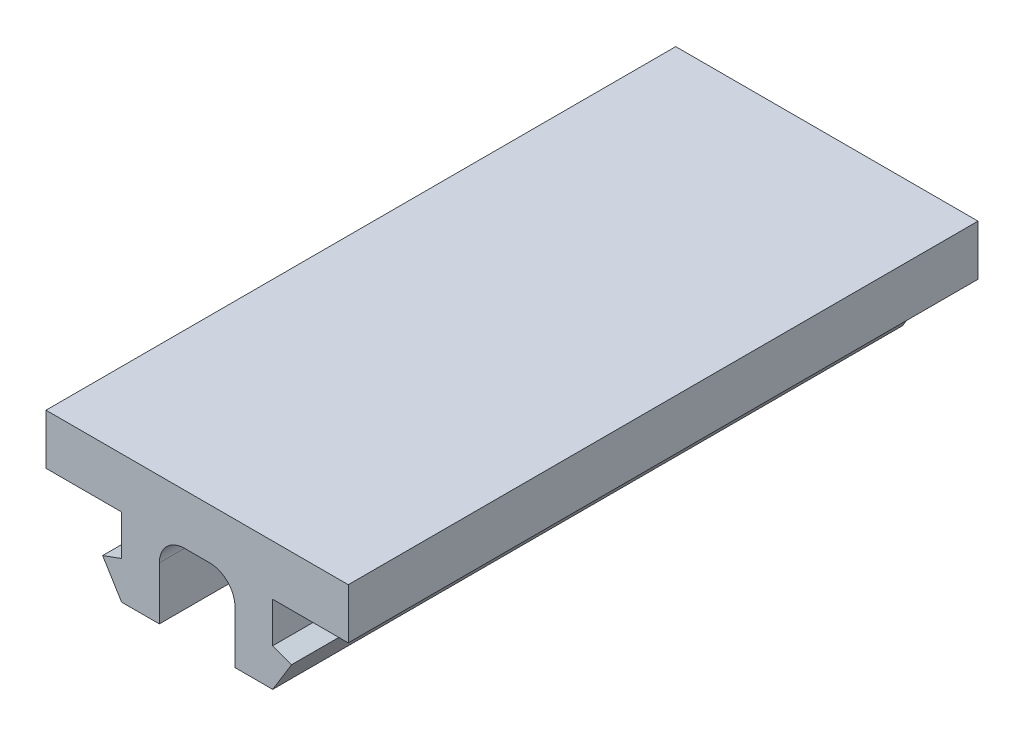
ISO-10303-21;
HEADER;
FILE_DESCRIPTION(('STEP AP214'),'2;1');
FILE_NAME('part.step','',(''),(''),'','','');
FILE_SCHEMA(('AUTOMOTIVE_DESIGN { 1 0 10303 214 1 1 1 1 }'));
ENDSEC;
DATA;
#1=APPLICATION_CONTEXT('core data for automotive mechanical design processes');
#2=APPLICATION_PROTOCOL_DEFINITION('international standard','automotive_design',2000,#1);
#3=PRODUCT_CONTEXT('',#1,'mechanical');
#4=PRODUCT('Part','Part','',(#3));
#5=PRODUCT_RELATED_PRODUCT_CATEGORY('part','',(#4));
#6=PRODUCT_DEFINITION_FORMATION('','',#4);
#7=PRODUCT_DEFINITION_CONTEXT('part definition',#1,'design');
#8=PRODUCT_DEFINITION('design','',#6,#7);
#9=PRODUCT_DEFINITION_SHAPE('','',#8);
#10=(LENGTH_UNIT() NAMED_UNIT(*) SI_UNIT(.MILLI.,.METRE.));
#11=(NAMED_UNIT(*) PLANE_ANGLE_UNIT() SI_UNIT($,.RADIAN.));
#12=(NAMED_UNIT(*) SI_UNIT($,.STERADIAN.) SOLID_ANGLE_UNIT());
#13=UNCERTAINTY_MEASURE_WITH_UNIT(LENGTH_MEASURE(1.E-05),#10,'distance_accuracy_value','');
#14=(GEOMETRIC_REPRESENTATION_CONTEXT(3) GLOBAL_UNCERTAINTY_ASSIGNED_CONTEXT((#13)) GLOBAL_UNIT_ASSIGNED_CONTEXT((#10,
#11,#12)) REPRESENTATION_CONTEXT('',''));
#15=CARTESIAN_POINT('',(0.,0.,0.));
#16=DIRECTION('',(0.,0.,1.));
#17=DIRECTION('',(1.,0.,0.));
#18=AXIS2_PLACEMENT_3D('',#15,#16,#17);
#19=CARTESIAN_POINT('',(12.,0.,25.));
#20=DIRECTION('',(-1.,0.,0.));
#21=DIRECTION('',(0.,0.,1.));
#22=AXIS2_PLACEMENT_3D('',#19,#20,#21);
#23=PLANE('',#22);
#24=DIRECTION('',(0.,1.,0.));
#25=VECTOR('',#24,1.);
#26=CARTESIAN_POINT('',(12.,0.,0.));
#27=LINE('',#26,#25);
#28=CARTESIAN_POINT('',(12.,-2.,0.));
#29=VERTEX_POINT('',#28);
#30=CARTESIAN_POINT('',(12.,0.,0.));
#31=VERTEX_POINT('',#30);
#32=EDGE_CURVE('E200',#29,#31,#27,.T.);
#33=ORIENTED_EDGE('',*,*,#32,.T.);
#34=DIRECTION('',(0.,0.,-1.));
#35=VECTOR('',#34,1.);
#36=CARTESIAN_POINT('',(12.,0.,25.));
#37=LINE('',#36,#35);
#38=CARTESIAN_POINT('',(12.,0.,25.));
#39=VERTEX_POINT('',#38);
#40=EDGE_CURVE('E11',#39,#31,#37,.T.);
#41=ORIENTED_EDGE('',*,*,#40,.F.);
#42=DIRECTION('',(0.,1.,0.));
#43=VECTOR('',#42,1.);
#44=CARTESIAN_POINT('',(12.,0.,25.));
#45=LINE('',#44,#43);
#46=CARTESIAN_POINT('',(12.,-2.,25.));
#47=VERTEX_POINT('',#46);
#48=EDGE_CURVE('E252',#47,#39,#45,.T.);
#49=ORIENTED_EDGE('',*,*,#48,.F.);
#50=DIRECTION('',(0.,0.,-1.));
#51=VECTOR('',#50,1.);
#52=CARTESIAN_POINT('',(12.,-2.,25.));
#53=LINE('',#52,#51);
#54=EDGE_CURVE('E196',#47,#29,#53,.T.);
#55=ORIENTED_EDGE('',*,*,#54,.T.);
#56=EDGE_LOOP('',(#33,#41,#49,#55));
#57=FACE_BOUND('',#56,.T.);
#58=ADVANCED_FACE('F39',(#57),#23,.F.);
#59=CARTESIAN_POINT('',(0.,0.,25.));
#60=DIRECTION('',(0.,-1.,0.));
#61=DIRECTION('',(0.,0.,-1.));
#62=AXIS2_PLACEMENT_3D('',#59,#60,#61);
#63=PLANE('',#62);
#64=DIRECTION('',(-1.,0.,0.));
#65=VECTOR('',#64,1.);
#66=CARTESIAN_POINT('',(0.,0.,0.));
#67=LINE('',#66,#65);
#68=CARTESIAN_POINT('',(0.,0.,0.));
#69=VERTEX_POINT('',#68);
#70=EDGE_CURVE('E204',#31,#69,#67,.T.);
#71=ORIENTED_EDGE('',*,*,#70,.T.);
#72=DIRECTION('',(0.,0.,-1.));
#73=VECTOR('',#72,1.);
#74=CARTESIAN_POINT('',(0.,0.,25.));
#75=LINE('',#74,#73);
#76=CARTESIAN_POINT('',(0.,0.,25.));
#77=VERTEX_POINT('',#76);
#78=EDGE_CURVE('E48',#77,#69,#75,.T.);
#79=ORIENTED_EDGE('',*,*,#78,.F.);
#80=DIRECTION('',(-1.,0.,0.));
#81=VECTOR('',#80,1.);
#82=CARTESIAN_POINT('',(0.,0.,25.));
#83=LINE('',#82,#81);
#84=EDGE_CURVE('E129',#39,#77,#83,.T.);
#85=ORIENTED_EDGE('',*,*,#84,.F.);
#86=ORIENTED_EDGE('',*,*,#40,.T.);
#87=EDGE_LOOP('',(#71,#79,#85,#86));
#88=FACE_BOUND('',#87,.T.);
#89=ADVANCED_FACE('F388',(#88),#63,.F.);
#90=CARTESIAN_POINT('',(0.,-2.,25.));
#91=DIRECTION('',(1.,0.,0.));
#92=DIRECTION('',(0.,0.,-1.));
#93=AXIS2_PLACEMENT_3D('',#90,#91,#92);
#94=PLANE('',#93);
#95=DIRECTION('',(0.,-1.,0.));
#96=VECTOR('',#95,1.);
#97=CARTESIAN_POINT('',(0.,-2.,0.));
#98=LINE('',#97,#96);
#99=CARTESIAN_POINT('',(0.,-2.,0.));
#100=VERTEX_POINT('',#99);
#101=EDGE_CURVE('E207',#69,#100,#98,.T.);
#102=ORIENTED_EDGE('',*,*,#101,.T.);
#103=DIRECTION('',(0.,0.,-1.));
#104=VECTOR('',#103,1.);
#105=CARTESIAN_POINT('',(0.,-2.,25.));
#106=LINE('',#105,#104);
#107=CARTESIAN_POINT('',(0.,-2.,25.));
#108=VERTEX_POINT('',#107);
#109=EDGE_CURVE('E303',#108,#100,#106,.T.);
#110=ORIENTED_EDGE('',*,*,#109,.F.);
#111=DIRECTION('',(0.,-1.,0.));
#112=VECTOR('',#111,1.);
#113=CARTESIAN_POINT('',(0.,-2.,25.));
#114=LINE('',#113,#112);
#115=EDGE_CURVE('E313',#77,#108,#114,.T.);
#116=ORIENTED_EDGE('',*,*,#115,.F.);
#117=ORIENTED_EDGE('',*,*,#78,.T.);
#118=EDGE_LOOP('',(#102,#110,#116,#117));
#119=FACE_BOUND('',#118,.T.);
#120=ADVANCED_FACE('F311',(#119),#94,.F.);
#121=CARTESIAN_POINT('',(3.,-2.,25.));
#122=DIRECTION('',(0.,1.,0.));
#123=DIRECTION('',(-1.,0.,0.));
#124=AXIS2_PLACEMENT_3D('',#121,#122,#123);
#125=PLANE('',#124);
#126=DIRECTION('',(1.,0.,0.));
#127=VECTOR('',#126,1.);
#128=CARTESIAN_POINT('',(3.,-2.,0.));
#129=LINE('',#128,#127);
#130=CARTESIAN_POINT('',(3.,-2.,0.));
#131=VERTEX_POINT('',#130);
#132=EDGE_CURVE('E210',#100,#131,#129,.T.);
#133=ORIENTED_EDGE('',*,*,#132,.T.);
#134=DIRECTION('',(0.,0.,-1.));
#135=VECTOR('',#134,1.);
#136=CARTESIAN_POINT('',(3.,-2.,25.));
#137=LINE('',#136,#135);
#138=CARTESIAN_POINT('',(3.,-2.,25.));
#139=VERTEX_POINT('',#138);
#140=EDGE_CURVE('E299',#139,#131,#137,.T.);
#141=ORIENTED_EDGE('',*,*,#140,.F.);
#142=DIRECTION('',(1.,0.,0.));
#143=VECTOR('',#142,1.);
#144=CARTESIAN_POINT('',(3.,-2.,25.));
#145=LINE('',#144,#143);
#146=EDGE_CURVE('E332',#108,#139,#145,.T.);
#147=ORIENTED_EDGE('',*,*,#146,.F.);
#148=ORIENTED_EDGE('',*,*,#109,.T.);
#149=EDGE_LOOP('',(#133,#141,#147,#148));
#150=FACE_BOUND('',#149,.T.);
#151=ADVANCED_FACE('F322',(#150),#125,.F.);
#152=CARTESIAN_POINT('',(3.,-3.6,25.));
#153=DIRECTION('',(1.,0.,0.));
#154=DIRECTION('',(0.,0.,-1.));
#155=AXIS2_PLACEMENT_3D('',#152,#153,#154);
#156=PLANE('',#155);
#157=DIRECTION('',(0.,-1.,0.));
#158=VECTOR('',#157,1.);
#159=CARTESIAN_POINT('',(3.,-3.6,0.));
#160=LINE('',#159,#158);
#161=CARTESIAN_POINT('',(3.,-3.6,0.));
#162=VERTEX_POINT('',#161);
#163=EDGE_CURVE('E213',#131,#162,#160,.T.);
#164=ORIENTED_EDGE('',*,*,#163,.T.);
#165=DIRECTION('',(0.,0.,-1.));
#166=VECTOR('',#165,1.);
#167=CARTESIAN_POINT('',(3.,-3.6,25.));
#168=LINE('',#167,#166);
#169=CARTESIAN_POINT('',(3.,-3.6,25.));
#170=VERTEX_POINT('',#169);
#171=EDGE_CURVE('E295',#170,#162,#168,.T.);
#172=ORIENTED_EDGE('',*,*,#171,.F.);
#173=DIRECTION('',(0.,-1.,0.));
#174=VECTOR('',#173,1.);
#175=CARTESIAN_POINT('',(3.,-3.6,25.));
#176=LINE('',#175,#174);
#177=EDGE_CURVE('E328',#139,#170,#176,.T.);
#178=ORIENTED_EDGE('',*,*,#177,.F.);
#179=ORIENTED_EDGE('',*,*,#140,.T.);
#180=EDGE_LOOP('',(#164,#172,#178,#179));
#181=FACE_BOUND('',#180,.T.);
#182=ADVANCED_FACE('F326',(#181),#156,.F.);
#183=CARTESIAN_POINT('',(2.24824590337127,-3.87361611466054,25.));
#184=DIRECTION('',(0.342020143325667,-0.939692620785909,0.));
#185=DIRECTION('',(0.939692620785909,0.342020143325667,0.));
#186=AXIS2_PLACEMENT_3D('',#183,#184,#185);
#187=PLANE('',#186);
#188=DIRECTION('',(-0.939692620785909,-0.342020143325667,0.));
#189=VECTOR('',#188,1.);
#190=CARTESIAN_POINT('',(2.24824590337127,-3.87361611466054,0.));
#191=LINE('',#190,#189);
#192=CARTESIAN_POINT('',(2.24824590337127,-3.87361611466054,0.));
#193=VERTEX_POINT('',#192);
#194=EDGE_CURVE('E216',#162,#193,#191,.T.);
#195=ORIENTED_EDGE('',*,*,#194,.T.);
#196=DIRECTION('',(0.,0.,-1.));
#197=VECTOR('',#196,1.);
#198=CARTESIAN_POINT('',(2.24824590337127,-3.87361611466054,25.));
#199=LINE('',#198,#197);
#200=CARTESIAN_POINT('',(2.24824590337127,-3.87361611466054,25.));
#201=VERTEX_POINT('',#200);
#202=EDGE_CURVE('E291',#201,#193,#199,.T.);
#203=ORIENTED_EDGE('',*,*,#202,.F.);
#204=DIRECTION('',(-0.939692620785909,-0.342020143325667,0.));
#205=VECTOR('',#204,1.);
#206=CARTESIAN_POINT('',(2.24824590337127,-3.87361611466054,25.));
#207=LINE('',#206,#205);
#208=EDGE_CURVE('E331',#170,#201,#207,.T.);
#209=ORIENTED_EDGE('',*,*,#208,.F.);
#210=ORIENTED_EDGE('',*,*,#171,.T.);
#211=EDGE_LOOP('',(#195,#203,#209,#210));
#212=FACE_BOUND('',#211,.T.);
#213=ADVANCED_FACE('F401',(#212),#187,.F.);
#214=CARTESIAN_POINT('',(3.,-5.1,25.));
#215=DIRECTION('',(0.852570445730035,0.522612318136197,0.));
#216=DIRECTION('',(-0.522612318136197,0.852570445730035,0.));
#217=AXIS2_PLACEMENT_3D('',#214,#215,#216);
#218=PLANE('',#217);
#219=DIRECTION('',(0.522612318136197,-0.852570445730035,0.));
#220=VECTOR('',#219,1.);
#221=CARTESIAN_POINT('',(3.,-5.1,0.));
#222=LINE('',#221,#220);
#223=CARTESIAN_POINT('',(3.,-5.1,0.));
#224=VERTEX_POINT('',#223);
#225=EDGE_CURVE('E219',#193,#224,#222,.T.);
#226=ORIENTED_EDGE('',*,*,#225,.T.);
#227=DIRECTION('',(0.,0.,-1.));
#228=VECTOR('',#227,1.);
#229=CARTESIAN_POINT('',(3.,-5.1,25.));
#230=LINE('',#229,#228);
#231=CARTESIAN_POINT('',(3.,-5.1,25.));
#232=VERTEX_POINT('',#231);
#233=EDGE_CURVE('E287',#232,#224,#230,.T.);
#234=ORIENTED_EDGE('',*,*,#233,.F.);
#235=DIRECTION('',(0.522612318136197,-0.852570445730035,0.));
#236=VECTOR('',#235,1.);
#237=CARTESIAN_POINT('',(3.,-5.1,25.));
#238=LINE('',#237,#236);
#239=EDGE_CURVE('E336',#201,#232,#238,.T.);
#240=ORIENTED_EDGE('',*,*,#239,.F.);
#241=ORIENTED_EDGE('',*,*,#202,.T.);
#242=EDGE_LOOP('',(#226,#234,#240,#241));
#243=FACE_BOUND('',#242,.T.);
#244=ADVANCED_FACE('F404',(#243),#218,.F.);
#245=CARTESIAN_POINT('',(4.5,-5.1,25.));
#246=DIRECTION('',(0.,1.,0.));
#247=DIRECTION('',(0.,0.,1.));
#248=AXIS2_PLACEMENT_3D('',#245,#246,#247);
#249=PLANE('',#248);
#250=DIRECTION('',(1.,0.,0.));
#251=VECTOR('',#250,1.);
#252=CARTESIAN_POINT('',(4.5,-5.1,0.));
#253=LINE('',#252,#251);
#254=CARTESIAN_POINT('',(4.5,-5.1,0.));
#255=VERTEX_POINT('',#254);
#256=EDGE_CURVE('E222',#224,#255,#253,.T.);
#257=ORIENTED_EDGE('',*,*,#256,.T.);
#258=DIRECTION('',(0.,0.,-1.));
#259=VECTOR('',#258,1.);
#260=CARTESIAN_POINT('',(4.5,-5.1,25.));
#261=LINE('',#260,#259);
#262=CARTESIAN_POINT('',(4.5,-5.1,25.));
#263=VERTEX_POINT('',#262);
#264=EDGE_CURVE('E283',#263,#255,#261,.T.);
#265=ORIENTED_EDGE('',*,*,#264,.F.);
#266=DIRECTION('',(1.,0.,0.));
#267=VECTOR('',#266,1.);
#268=CARTESIAN_POINT('',(4.5,-5.1,25.));
#269=LINE('',#268,#267);
#270=EDGE_CURVE('E343',#232,#263,#269,.T.);
#271=ORIENTED_EDGE('',*,*,#270,.F.);
#272=ORIENTED_EDGE('',*,*,#233,.T.);
#273=EDGE_LOOP('',(#257,#265,#271,#272));
#274=FACE_BOUND('',#273,.T.);
#275=ADVANCED_FACE('F408',(#274),#249,.F.);
#276=CARTESIAN_POINT('',(4.5,-5.1,25.));
#277=DIRECTION('',(-1.,0.,0.));
#278=DIRECTION('',(0.,0.,1.));
#279=AXIS2_PLACEMENT_3D('',#276,#277,#278);
#280=PLANE('',#279);
#281=DIRECTION('',(0.,1.,0.));
#282=VECTOR('',#281,1.);
#283=CARTESIAN_POINT('',(4.5,-5.1,0.));
#284=LINE('',#283,#282);
#285=CARTESIAN_POINT('',(4.5,-3.,0.));
#286=VERTEX_POINT('',#285);
#287=EDGE_CURVE('E225',#255,#286,#284,.T.);
#288=ORIENTED_EDGE('',*,*,#287,.T.);
#289=DIRECTION('',(0.,0.,-1.));
#290=VECTOR('',#289,1.);
#291=CARTESIAN_POINT('',(4.5,-3.,25.));
#292=LINE('',#291,#290);
#293=CARTESIAN_POINT('',(4.5,-3.,25.));
#294=VERTEX_POINT('',#293);
#295=EDGE_CURVE('E279',#294,#286,#292,.T.);
#296=ORIENTED_EDGE('',*,*,#295,.F.);
#297=DIRECTION('',(0.,1.,0.));
#298=VECTOR('',#297,1.);
#299=CARTESIAN_POINT('',(4.5,-5.1,25.));
#300=LINE('',#299,#298);
#301=EDGE_CURVE('E346',#263,#294,#300,.T.);
#302=ORIENTED_EDGE('',*,*,#301,.F.);
#303=ORIENTED_EDGE('',*,*,#264,.T.);
#304=EDGE_LOOP('',(#288,#296,#302,#303));
#305=FACE_BOUND('',#304,.T.);
#306=ADVANCED_FACE('F412',(#305),#280,.F.);
#307=CARTESIAN_POINT('',(5.5,-3.,25.));
#308=DIRECTION('',(0.,0.,-1.));
#309=DIRECTION('',(-1.,0.,0.));
#310=AXIS2_PLACEMENT_3D('',#307,#308,#309);
#311=CYLINDRICAL_SURFACE('',#310,1.);
#312=CARTESIAN_POINT('',(5.5,-3.,0.));
#313=DIRECTION('',(0.,0.,-1.));
#314=DIRECTION('',(1.,0.,0.));
#315=AXIS2_PLACEMENT_3D('',#312,#313,#314);
#316=CIRCLE('',#315,1.);
#317=CARTESIAN_POINT('',(5.5,-2.,0.));
#318=VERTEX_POINT('',#317);
#319=EDGE_CURVE('E228',#286,#318,#316,.T.);
#320=ORIENTED_EDGE('',*,*,#319,.T.);
#321=DIRECTION('',(0.,0.,-1.));
#322=VECTOR('',#321,1.);
#323=CARTESIAN_POINT('',(5.5,-2.,25.));
#324=LINE('',#323,#322);
#325=CARTESIAN_POINT('',(5.5,-2.,25.));
#326=VERTEX_POINT('',#325);
#327=EDGE_CURVE('E275',#326,#318,#324,.T.);
#328=ORIENTED_EDGE('',*,*,#327,.F.);
#329=CARTESIAN_POINT('',(5.5,-3.,25.));
#330=DIRECTION('',(0.,0.,-1.));
#331=DIRECTION('',(1.,0.,0.));
#332=AXIS2_PLACEMENT_3D('',#329,#330,#331);
#333=CIRCLE('',#332,1.);
#334=EDGE_CURVE('E349',#294,#326,#333,.T.);
#335=ORIENTED_EDGE('',*,*,#334,.F.);
#336=ORIENTED_EDGE('',*,*,#295,.T.);
#337=EDGE_LOOP('',(#320,#328,#335,#336));
#338=FACE_BOUND('',#337,.T.);
#339=ADVANCED_FACE('F416',(#338),#311,.F.);
#340=CARTESIAN_POINT('',(5.5,-2.,25.));
#341=DIRECTION('',(0.,1.,0.));
#342=DIRECTION('',(0.,0.,1.));
#343=AXIS2_PLACEMENT_3D('',#340,#341,#342);
#344=PLANE('',#343);
#345=DIRECTION('',(1.,0.,0.));
#346=VECTOR('',#345,1.);
#347=CARTESIAN_POINT('',(5.5,-2.,0.));
#348=LINE('',#347,#346);
#349=CARTESIAN_POINT('',(6.5,-2.,0.));
#350=VERTEX_POINT('',#349);
#351=EDGE_CURVE('E231',#318,#350,#348,.T.);
#352=ORIENTED_EDGE('',*,*,#351,.T.);
#353=DIRECTION('',(0.,0.,-1.));
#354=VECTOR('',#353,1.);
#355=CARTESIAN_POINT('',(6.5,-2.,25.));
#356=LINE('',#355,#354);
#357=CARTESIAN_POINT('',(6.5,-2.,25.));
#358=VERTEX_POINT('',#357);
#359=EDGE_CURVE('E271',#358,#350,#356,.T.);
#360=ORIENTED_EDGE('',*,*,#359,.F.);
#361=DIRECTION('',(1.,0.,0.));
#362=VECTOR('',#361,1.);
#363=CARTESIAN_POINT('',(5.5,-2.,25.));
#364=LINE('',#363,#362);
#365=EDGE_CURVE('E352',#326,#358,#364,.T.);
#366=ORIENTED_EDGE('',*,*,#365,.F.);
#367=ORIENTED_EDGE('',*,*,#327,.T.);
#368=EDGE_LOOP('',(#352,#360,#366,#367));
#369=FACE_BOUND('',#368,.T.);
#370=ADVANCED_FACE('F420',(#369),#344,.F.);
#371=CARTESIAN_POINT('',(6.5,-3.,25.));
#372=DIRECTION('',(0.,0.,-1.));
#373=DIRECTION('',(-1.,0.,0.));
#374=AXIS2_PLACEMENT_3D('',#371,#372,#373);
#375=CYLINDRICAL_SURFACE('',#374,1.);
#376=CARTESIAN_POINT('',(6.5,-3.,0.));
#377=DIRECTION('',(0.,0.,-1.));
#378=DIRECTION('',(1.,0.,0.));
#379=AXIS2_PLACEMENT_3D('',#376,#377,#378);
#380=CIRCLE('',#379,1.);
#381=CARTESIAN_POINT('',(7.5,-3.,0.));
#382=VERTEX_POINT('',#381);
#383=EDGE_CURVE('E234',#350,#382,#380,.T.);
#384=ORIENTED_EDGE('',*,*,#383,.T.);
#385=DIRECTION('',(0.,0.,-1.));
#386=VECTOR('',#385,1.);
#387=CARTESIAN_POINT('',(7.5,-3.,25.));
#388=LINE('',#387,#386);
#389=CARTESIAN_POINT('',(7.5,-3.,25.));
#390=VERTEX_POINT('',#389);
#391=EDGE_CURVE('E267',#390,#382,#388,.T.);
#392=ORIENTED_EDGE('',*,*,#391,.F.);
#393=CARTESIAN_POINT('',(6.5,-3.,25.));
#394=DIRECTION('',(0.,0.,-1.));
#395=DIRECTION('',(1.,0.,0.));
#396=AXIS2_PLACEMENT_3D('',#393,#394,#395);
#397=CIRCLE('',#396,1.);
#398=EDGE_CURVE('E355',#358,#390,#397,.T.);
#399=ORIENTED_EDGE('',*,*,#398,.F.);
#400=ORIENTED_EDGE('',*,*,#359,.T.);
#401=EDGE_LOOP('',(#384,#392,#399,#400));
#402=FACE_BOUND('',#401,.T.);
#403=ADVANCED_FACE('F424',(#402),#375,.F.);
#404=CARTESIAN_POINT('',(7.5,-5.1,25.));
#405=DIRECTION('',(1.,0.,0.));
#406=DIRECTION('',(0.,0.,-1.));
#407=AXIS2_PLACEMENT_3D('',#404,#405,#406);
#408=PLANE('',#407);
#409=DIRECTION('',(0.,-1.,0.));
#410=VECTOR('',#409,1.);
#411=CARTESIAN_POINT('',(7.5,-5.1,0.));
#412=LINE('',#411,#410);
#413=CARTESIAN_POINT('',(7.5,-5.1,0.));
#414=VERTEX_POINT('',#413);
#415=EDGE_CURVE('E237',#382,#414,#412,.T.);
#416=ORIENTED_EDGE('',*,*,#415,.T.);
#417=DIRECTION('',(0.,0.,-1.));
#418=VECTOR('',#417,1.);
#419=CARTESIAN_POINT('',(7.5,-5.1,25.));
#420=LINE('',#419,#418);
#421=CARTESIAN_POINT('',(7.5,-5.1,25.));
#422=VERTEX_POINT('',#421);
#423=EDGE_CURVE('E263',#422,#414,#420,.T.);
#424=ORIENTED_EDGE('',*,*,#423,.F.);
#425=DIRECTION('',(0.,-1.,0.));
#426=VECTOR('',#425,1.);
#427=CARTESIAN_POINT('',(7.5,-5.1,25.));
#428=LINE('',#427,#426);
#429=EDGE_CURVE('E358',#390,#422,#428,.T.);
#430=ORIENTED_EDGE('',*,*,#429,.F.);
#431=ORIENTED_EDGE('',*,*,#391,.T.);
#432=EDGE_LOOP('',(#416,#424,#430,#431));
#433=FACE_BOUND('',#432,.T.);
#434=ADVANCED_FACE('F428',(#433),#408,.F.);
#435=CARTESIAN_POINT('',(9.,-5.1,25.));
#436=DIRECTION('',(0.,1.,0.));
#437=DIRECTION('',(0.,0.,1.));
#438=AXIS2_PLACEMENT_3D('',#435,#436,#437);
#439=PLANE('',#438);
#440=DIRECTION('',(1.,0.,0.));
#441=VECTOR('',#440,1.);
#442=CARTESIAN_POINT('',(9.,-5.1,0.));
#443=LINE('',#442,#441);
#444=CARTESIAN_POINT('',(9.,-5.1,0.));
#445=VERTEX_POINT('',#444);
#446=EDGE_CURVE('E240',#414,#445,#443,.T.);
#447=ORIENTED_EDGE('',*,*,#446,.T.);
#448=DIRECTION('',(0.,0.,-1.));
#449=VECTOR('',#448,1.);
#450=CARTESIAN_POINT('',(9.,-5.1,25.));
#451=LINE('',#450,#449);
#452=CARTESIAN_POINT('',(9.,-5.1,25.));
#453=VERTEX_POINT('',#452);
#454=EDGE_CURVE('E259',#453,#445,#451,.T.);
#455=ORIENTED_EDGE('',*,*,#454,.F.);
#456=DIRECTION('',(1.,0.,0.));
#457=VECTOR('',#456,1.);
#458=CARTESIAN_POINT('',(9.,-5.1,25.));
#459=LINE('',#458,#457);
#460=EDGE_CURVE('E361',#422,#453,#459,.T.);
#461=ORIENTED_EDGE('',*,*,#460,.F.);
#462=ORIENTED_EDGE('',*,*,#423,.T.);
#463=EDGE_LOOP('',(#447,#455,#461,#462));
#464=FACE_BOUND('',#463,.T.);
#465=ADVANCED_FACE('F369',(#464),#439,.F.);
#466=CARTESIAN_POINT('',(9.75175409662873,-3.87361611466054,25.));
#467=DIRECTION('',(-0.852570445730035,0.522612318136197,0.));
#468=DIRECTION('',(-0.522612318136197,-0.852570445730035,0.));
#469=AXIS2_PLACEMENT_3D('',#466,#467,#468);
#470=PLANE('',#469);
#471=DIRECTION('',(0.522612318136197,0.852570445730035,0.));
#472=VECTOR('',#471,1.);
#473=CARTESIAN_POINT('',(9.75175409662873,-3.87361611466054,0.));
#474=LINE('',#473,#472);
#475=CARTESIAN_POINT('',(9.75175409662873,-3.87361611466054,0.));
#476=VERTEX_POINT('',#475);
#477=EDGE_CURVE('E243',#445,#476,#474,.T.);
#478=ORIENTED_EDGE('',*,*,#477,.T.);
#479=DIRECTION('',(0.,0.,-1.));
#480=VECTOR('',#479,1.);
#481=CARTESIAN_POINT('',(9.75175409662873,-3.87361611466054,25.));
#482=LINE('',#481,#480);
#483=CARTESIAN_POINT('',(9.75175409662873,-3.87361611466054,25.));
#484=VERTEX_POINT('',#483);
#485=EDGE_CURVE('E189',#484,#476,#482,.T.);
#486=ORIENTED_EDGE('',*,*,#485,.F.);
#487=DIRECTION('',(0.522612318136197,0.852570445730035,0.));
#488=VECTOR('',#487,1.);
#489=CARTESIAN_POINT('',(9.75175409662873,-3.87361611466054,25.));
#490=LINE('',#489,#488);
#491=EDGE_CURVE('E178',#453,#484,#490,.T.);
#492=ORIENTED_EDGE('',*,*,#491,.F.);
#493=ORIENTED_EDGE('',*,*,#454,.T.);
#494=EDGE_LOOP('',(#478,#486,#492,#493));
#495=FACE_BOUND('',#494,.T.);
#496=ADVANCED_FACE('F373',(#495),#470,.F.);
#497=CARTESIAN_POINT('',(9.,-3.6,25.));
#498=DIRECTION('',(-0.342020143325667,-0.939692620785909,0.));
#499=DIRECTION('',(0.939692620785909,-0.342020143325667,0.));
#500=AXIS2_PLACEMENT_3D('',#497,#498,#499);
#501=PLANE('',#500);
#502=DIRECTION('',(-0.939692620785909,0.342020143325667,0.));
#503=VECTOR('',#502,1.);
#504=CARTESIAN_POINT('',(9.,-3.6,0.));
#505=LINE('',#504,#503);
#506=CARTESIAN_POINT('',(9.,-3.6,0.));
#507=VERTEX_POINT('',#506);
#508=EDGE_CURVE('E187',#476,#507,#505,.T.);
#509=ORIENTED_EDGE('',*,*,#508,.T.);
#510=DIRECTION('',(0.,0.,-1.));
#511=VECTOR('',#510,1.);
#512=CARTESIAN_POINT('',(9.,-3.6,25.));
#513=LINE('',#512,#511);
#514=CARTESIAN_POINT('',(9.,-3.6,25.));
#515=VERTEX_POINT('',#514);
#516=EDGE_CURVE('E184',#515,#507,#513,.T.);
#517=ORIENTED_EDGE('',*,*,#516,.F.);
#518=DIRECTION('',(-0.939692620785909,0.342020143325667,0.));
#519=VECTOR('',#518,1.);
#520=CARTESIAN_POINT('',(9.,-3.6,25.));
#521=LINE('',#520,#519);
#522=EDGE_CURVE('E172',#484,#515,#521,.T.);
#523=ORIENTED_EDGE('',*,*,#522,.F.);
#524=ORIENTED_EDGE('',*,*,#485,.T.);
#525=EDGE_LOOP('',(#509,#517,#523,#524));
#526=FACE_BOUND('',#525,.T.);
#527=ADVANCED_FACE('F185',(#526),#501,.F.);
#528=CARTESIAN_POINT('',(9.,-2.,25.));
#529=DIRECTION('',(-1.,0.,0.));
#530=DIRECTION('',(0.,0.,1.));
#531=AXIS2_PLACEMENT_3D('',#528,#529,#530);
#532=PLANE('',#531);
#533=DIRECTION('',(0.,1.,0.));
#534=VECTOR('',#533,1.);
#535=CARTESIAN_POINT('',(9.,-2.,0.));
#536=LINE('',#535,#534);
#537=CARTESIAN_POINT('',(9.,-2.,0.));
#538=VERTEX_POINT('',#537);
#539=EDGE_CURVE('E115',#507,#538,#536,.T.);
#540=ORIENTED_EDGE('',*,*,#539,.T.);
#541=DIRECTION('',(0.,0.,-1.));
#542=VECTOR('',#541,1.);
#543=CARTESIAN_POINT('',(9.,-2.,25.));
#544=LINE('',#543,#542);
#545=CARTESIAN_POINT('',(9.,-2.,25.));
#546=VERTEX_POINT('',#545);
#547=EDGE_CURVE('E190',#546,#538,#544,.T.);
#548=ORIENTED_EDGE('',*,*,#547,.F.);
#549=DIRECTION('',(0.,1.,0.));
#550=VECTOR('',#549,1.);
#551=CARTESIAN_POINT('',(9.,-2.,25.));
#552=LINE('',#551,#550);
#553=EDGE_CURVE('E176',#515,#546,#552,.T.);
#554=ORIENTED_EDGE('',*,*,#553,.F.);
#555=ORIENTED_EDGE('',*,*,#516,.T.);
#556=EDGE_LOOP('',(#540,#548,#554,#555));
#557=FACE_BOUND('',#556,.T.);
#558=ADVANCED_FACE('F192',(#557),#532,.F.);
#559=CARTESIAN_POINT('',(12.,-2.,25.));
#560=DIRECTION('',(0.,1.,0.));
#561=DIRECTION('',(-1.,0.,0.));
#562=AXIS2_PLACEMENT_3D('',#559,#560,#561);
#563=PLANE('',#562);
#564=DIRECTION('',(1.,0.,0.));
#565=VECTOR('',#564,1.);
#566=CARTESIAN_POINT('',(12.,-2.,0.));
#567=LINE('',#566,#565);
#568=EDGE_CURVE('E121',#538,#29,#567,.T.);
#569=ORIENTED_EDGE('',*,*,#568,.T.);
#570=ORIENTED_EDGE('',*,*,#54,.F.);
#571=DIRECTION('',(1.,0.,0.));
#572=VECTOR('',#571,1.);
#573=CARTESIAN_POINT('',(12.,-2.,25.));
#574=LINE('',#573,#572);
#575=EDGE_CURVE('E56',#546,#47,#574,.T.);
#576=ORIENTED_EDGE('',*,*,#575,.F.);
#577=ORIENTED_EDGE('',*,*,#547,.T.);
#578=EDGE_LOOP('',(#569,#570,#576,#577));
#579=FACE_BOUND('',#578,.T.);
#580=ADVANCED_FACE('F377',(#579),#563,.F.);
#581=CARTESIAN_POINT('',(6.5,-3.,25.));
#582=DIRECTION('',(0.,0.,1.));
#583=DIRECTION('',(1.,0.,0.));
#584=AXIS2_PLACEMENT_3D('',#581,#582,#583);
#585=PLANE('',#584);
#586=ORIENTED_EDGE('',*,*,#48,.T.);
#587=ORIENTED_EDGE('',*,*,#84,.T.);
#588=ORIENTED_EDGE('',*,*,#115,.T.);
#589=ORIENTED_EDGE('',*,*,#146,.T.);
#590=ORIENTED_EDGE('',*,*,#177,.T.);
#591=ORIENTED_EDGE('',*,*,#208,.T.);
#592=ORIENTED_EDGE('',*,*,#239,.T.);
#593=ORIENTED_EDGE('',*,*,#270,.T.);
#594=ORIENTED_EDGE('',*,*,#301,.T.);
#595=ORIENTED_EDGE('',*,*,#334,.T.);
#596=ORIENTED_EDGE('',*,*,#365,.T.);
#597=ORIENTED_EDGE('',*,*,#398,.T.);
#598=ORIENTED_EDGE('',*,*,#429,.T.);
#599=ORIENTED_EDGE('',*,*,#460,.T.);
#600=ORIENTED_EDGE('',*,*,#491,.T.);
#601=ORIENTED_EDGE('',*,*,#522,.T.);
#602=ORIENTED_EDGE('',*,*,#553,.T.);
#603=ORIENTED_EDGE('',*,*,#575,.T.);
#604=EDGE_LOOP('',(#586,#587,#588,#589,#590,#591,#592,#593,#594,#595,#596,#597,#598,#599,#600,
#601,#602,#603));
#605=FACE_BOUND('',#604,.T.);
#606=ADVANCED_FACE('F174',(#605),#585,.T.);
#607=CARTESIAN_POINT('',(6.5,-3.,0.));
#608=DIRECTION('',(0.,0.,1.));
#609=DIRECTION('',(1.,0.,0.));
#610=AXIS2_PLACEMENT_3D('',#607,#608,#609);
#611=PLANE('',#610);
#612=ORIENTED_EDGE('',*,*,#32,.F.);
#613=ORIENTED_EDGE('',*,*,#568,.F.);
#614=ORIENTED_EDGE('',*,*,#539,.F.);
#615=ORIENTED_EDGE('',*,*,#508,.F.);
#616=ORIENTED_EDGE('',*,*,#477,.F.);
#617=ORIENTED_EDGE('',*,*,#446,.F.);
#618=ORIENTED_EDGE('',*,*,#415,.F.);
#619=ORIENTED_EDGE('',*,*,#383,.F.);
#620=ORIENTED_EDGE('',*,*,#351,.F.);
#621=ORIENTED_EDGE('',*,*,#319,.F.);
#622=ORIENTED_EDGE('',*,*,#287,.F.);
#623=ORIENTED_EDGE('',*,*,#256,.F.);
#624=ORIENTED_EDGE('',*,*,#225,.F.);
#625=ORIENTED_EDGE('',*,*,#194,.F.);
#626=ORIENTED_EDGE('',*,*,#163,.F.);
#627=ORIENTED_EDGE('',*,*,#132,.F.);
#628=ORIENTED_EDGE('',*,*,#101,.F.);
#629=ORIENTED_EDGE('',*,*,#70,.F.);
#630=EDGE_LOOP('',(#612,#613,#614,#615,#616,#617,#618,#619,#620,#621,#622,#623,#624,#625,#626,
#627,#628,#629));
#631=FACE_BOUND('',#630,.T.);
#632=ADVANCED_FACE('F317',(#631),#611,.F.);
#633=CLOSED_SHELL('',(#58,#89,#120,#151,#182,#213,#244,#275,#306,#339,#370,#403,#434,#465,#496,
#527,#558,#580,#606,#632));
#634=MANIFOLD_SOLID_BREP('B2',#633);
#635=ADVANCED_BREP_SHAPE_REPRESENTATION('',(#18,#634),#14);
#636=SHAPE_DEFINITION_REPRESENTATION(#9,#635);
ENDSEC;
END-ISO-10303-21;
